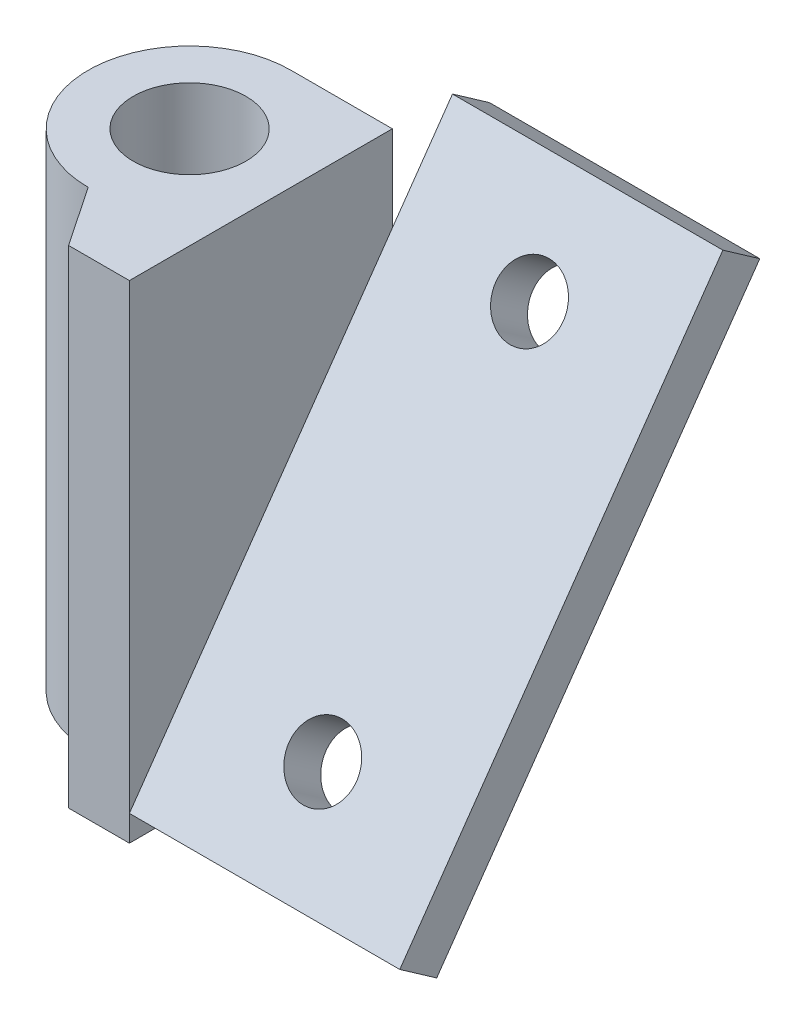
ISO-10303-21;
HEADER;
FILE_DESCRIPTION(('STEP AP214'),'2;1');
FILE_NAME('part.step','',(''),(''),'','','');
FILE_SCHEMA(('AUTOMOTIVE_DESIGN { 1 0 10303 214 1 1 1 1 }'));
ENDSEC;
DATA;
#1=APPLICATION_CONTEXT('core data for automotive mechanical design processes');
#2=APPLICATION_PROTOCOL_DEFINITION('international standard','automotive_design',2000,#1);
#3=PRODUCT_CONTEXT('',#1,'mechanical');
#4=PRODUCT('Part','Part','',(#3));
#5=PRODUCT_RELATED_PRODUCT_CATEGORY('part','',(#4));
#6=PRODUCT_DEFINITION_FORMATION('','',#4);
#7=PRODUCT_DEFINITION_CONTEXT('part definition',#1,'design');
#8=PRODUCT_DEFINITION('design','',#6,#7);
#9=PRODUCT_DEFINITION_SHAPE('','',#8);
#10=(LENGTH_UNIT() NAMED_UNIT(*) SI_UNIT(.MILLI.,.METRE.));
#11=(NAMED_UNIT(*) PLANE_ANGLE_UNIT() SI_UNIT($,.RADIAN.));
#12=(NAMED_UNIT(*) SI_UNIT($,.STERADIAN.) SOLID_ANGLE_UNIT());
#13=UNCERTAINTY_MEASURE_WITH_UNIT(LENGTH_MEASURE(1.E-05),#10,'distance_accuracy_value','');
#14=(GEOMETRIC_REPRESENTATION_CONTEXT(3) GLOBAL_UNCERTAINTY_ASSIGNED_CONTEXT((#13)) GLOBAL_UNIT_ASSIGNED_CONTEXT((#10,
#11,#12)) REPRESENTATION_CONTEXT('',''));
#15=CARTESIAN_POINT('',(0.,0.,0.));
#16=DIRECTION('',(0.,0.,1.));
#17=DIRECTION('',(1.,0.,0.));
#18=AXIS2_PLACEMENT_3D('',#15,#16,#17);
#19=CARTESIAN_POINT('',(0.,10.,0.));
#20=DIRECTION('',(0.,1.,0.));
#21=DIRECTION('',(0.,0.,1.));
#22=AXIS2_PLACEMENT_3D('',#19,#20,#21);
#23=PLANE('',#22);
#24=DIRECTION('',(-1.,0.,0.));
#25=VECTOR('',#24,1.);
#26=CARTESIAN_POINT('',(4.5,10.,-4.5));
#27=LINE('',#26,#25);
#28=CARTESIAN_POINT('',(5.03673261402154,10.,-4.5));
#29=VERTEX_POINT('',#28);
#30=CARTESIAN_POINT('',(4.5,10.,-4.5));
#31=VERTEX_POINT('',#30);
#32=EDGE_CURVE('E48',#29,#31,#27,.T.);
#33=ORIENTED_EDGE('',*,*,#32,.T.);
#34=DIRECTION('',(0.,0.,1.));
#35=VECTOR('',#34,1.);
#36=CARTESIAN_POINT('',(4.5,10.,0.));
#37=LINE('',#36,#35);
#38=CARTESIAN_POINT('',(4.5,10.,-3.72284997085863));
#39=VERTEX_POINT('',#38);
#40=EDGE_CURVE('E196',#31,#39,#37,.T.);
#41=ORIENTED_EDGE('',*,*,#40,.T.);
#42=DIRECTION('',(-1.,0.,0.));
#43=VECTOR('',#42,1.);
#44=CARTESIAN_POINT('',(16.5,10.,-3.72284997085863));
#45=LINE('',#44,#43);
#46=CARTESIAN_POINT('',(6.5,10.,-3.72284997085863));
#47=VERTEX_POINT('',#46);
#48=EDGE_CURVE('E261',#47,#39,#45,.T.);
#49=ORIENTED_EDGE('',*,*,#48,.F.);
#50=CARTESIAN_POINT('',(6.5,10.,-6.16439914838155));
#51=DIRECTION('',(0.,1.,0.));
#52=DIRECTION('',(0.,0.,1.));
#53=AXIS2_PLACEMENT_3D('',#50,#51,#52);
#54=ELLIPSE('',#53,2.44154917752292,2.);
#55=EDGE_CURVE('E267',#47,#29,#54,.F.);
#56=ORIENTED_EDGE('',*,*,#55,.T.);
#57=EDGE_LOOP('',(#33,#41,#49,#56));
#58=FACE_BOUND('',#57,.T.);
#59=ADVANCED_FACE('F33',(#58),#23,.T.);
#60=CARTESIAN_POINT('',(0.,0.,0.));
#61=DIRECTION('',(0.,1.,0.));
#62=DIRECTION('',(0.,0.,1.));
#63=AXIS2_PLACEMENT_3D('',#60,#61,#62);
#64=PLANE('',#63);
#65=DIRECTION('',(0.,0.,1.));
#66=VECTOR('',#65,1.);
#67=CARTESIAN_POINT('',(4.5,0.,0.));
#68=LINE('',#67,#66);
#69=CARTESIAN_POINT('',(4.5,0.,0.837676233715618));
#70=VERTEX_POINT('',#69);
#71=CARTESIAN_POINT('',(4.5,0.,3.27922541123854));
#72=VERTEX_POINT('',#71);
#73=EDGE_CURVE('E194',#70,#72,#68,.T.);
#74=ORIENTED_EDGE('',*,*,#73,.F.);
#75=CARTESIAN_POINT('',(6.5,0.,0.837676233715616));
#76=DIRECTION('',(0.,1.,0.));
#77=DIRECTION('',(0.,0.,1.));
#78=AXIS2_PLACEMENT_3D('',#75,#76,#77);
#79=ELLIPSE('',#78,2.44154917752292,2.);
#80=CARTESIAN_POINT('',(6.5,0.,3.27922541123854));
#81=VERTEX_POINT('',#80);
#82=EDGE_CURVE('E11',#70,#81,#79,.T.);
#83=ORIENTED_EDGE('',*,*,#82,.T.);
#84=DIRECTION('',(1.,0.,0.));
#85=VECTOR('',#84,1.);
#86=CARTESIAN_POINT('',(0.,0.,3.27922541123854));
#87=LINE('',#86,#85);
#88=EDGE_CURVE('E255',#72,#81,#87,.T.);
#89=ORIENTED_EDGE('',*,*,#88,.F.);
#90=EDGE_LOOP('',(#74,#83,#89));
#91=FACE_BOUND('',#90,.T.);
#92=ADVANCED_FACE('F329',(#91),#64,.F.);
#93=CARTESIAN_POINT('',(4.5,0.,0.));
#94=DIRECTION('',(-1.,0.,0.));
#95=DIRECTION('',(0.,0.,1.));
#96=AXIS2_PLACEMENT_3D('',#93,#94,#95);
#97=PLANE('',#96);
#98=DIRECTION('',(0.,0.819152044288989,-0.57357643635105));
#99=VECTOR('',#98,1.);
#100=CARTESIAN_POINT('',(4.5,11.1098852650578,-4.5));
#101=LINE('',#100,#99);
#102=CARTESIAN_POINT('',(4.5,11.1098852650578,-4.5));
#103=VERTEX_POINT('',#102);
#104=CARTESIAN_POINT('',(4.5,17.2623605068708,-8.8080095429661));
#105=VERTEX_POINT('',#104);
#106=EDGE_CURVE('E229',#103,#105,#101,.T.);
#107=ORIENTED_EDGE('',*,*,#106,.F.);
#108=DIRECTION('',(0.,1.,0.));
#109=VECTOR('',#108,1.);
#110=CARTESIAN_POINT('',(4.5,-3.21644060035393,-4.5));
#111=LINE('',#110,#109);
#112=CARTESIAN_POINT('',(4.5,14.5967788563,-4.5));
#113=VERTEX_POINT('',#112);
#114=EDGE_CURVE('E192',#103,#113,#111,.T.);
#115=ORIENTED_EDGE('',*,*,#114,.T.);
#116=DIRECTION('',(0.,-0.819152044288989,0.57357643635105));
#117=VECTOR('',#116,1.);
#118=CARTESIAN_POINT('',(4.5,1.74344679562108,4.5));
#119=LINE('',#118,#117);
#120=CARTESIAN_POINT('',(4.5,18.4095133795729,-7.16970545438812));
#121=VERTEX_POINT('',#120);
#122=EDGE_CURVE('E241',#121,#113,#119,.T.);
#123=ORIENTED_EDGE('',*,*,#122,.F.);
#124=DIRECTION('',(0.,0.57357643635105,0.819152044288989));
#125=VECTOR('',#124,1.);
#126=CARTESIAN_POINT('',(4.5,17.2623605068708,-8.8080095429661));
#127=LINE('',#126,#125);
#128=EDGE_CURVE('E226',#105,#121,#127,.T.);
#129=ORIENTED_EDGE('',*,*,#128,.F.);
#130=EDGE_LOOP('',(#107,#115,#123,#129));
#131=FACE_BOUND('',#130,.T.);
#132=ADVANCED_FACE('F313',(#131),#97,.T.);
#133=CARTESIAN_POINT('',(4.5,10.,0.));
#134=DIRECTION('',(-1.,0.,0.));
#135=DIRECTION('',(0.,0.,1.));
#136=AXIS2_PLACEMENT_3D('',#133,#134,#135);
#137=PLANE('',#136);
#138=CARTESIAN_POINT('',(4.50000000000001,-2.06928772765183,7.16970545438812));
#139=VERTEX_POINT('',#138);
#140=EDGE_CURVE('E248',#113,#139,#119,.T.);
#141=ORIENTED_EDGE('',*,*,#140,.F.);
#142=CARTESIAN_POINT('',(4.5,18.4095133795729,-4.5));
#143=VERTEX_POINT('',#142);
#144=EDGE_CURVE('E190',#113,#143,#111,.T.);
#145=ORIENTED_EDGE('',*,*,#144,.T.);
#146=DIRECTION('',(0.,0.,1.));
#147=VECTOR('',#146,1.);
#148=CARTESIAN_POINT('',(4.5,18.4095133795729,-4.5));
#149=LINE('',#148,#147);
#150=CARTESIAN_POINT('',(4.50000000000001,18.4095133795729,7.16970545438812));
#151=VERTEX_POINT('',#150);
#152=EDGE_CURVE('E172',#143,#151,#149,.T.);
#153=ORIENTED_EDGE('',*,*,#152,.T.);
#154=DIRECTION('',(0.,1.,0.));
#155=VECTOR('',#154,1.);
#156=CARTESIAN_POINT('',(4.50000000000001,-8.44877537683658,7.16970545438812));
#157=LINE('',#156,#155);
#158=EDGE_CURVE('E146',#139,#151,#157,.T.);
#159=ORIENTED_EDGE('',*,*,#158,.F.);
#160=EDGE_LOOP('',(#141,#145,#153,#159));
#161=FACE_BOUND('',#160,.T.);
#162=ADVANCED_FACE('F291',(#161),#137,.F.);
#163=DIRECTION('',(0.,-1.,0.));
#164=VECTOR('',#163,1.);
#165=CARTESIAN_POINT('',(4.5,10.,-4.5));
#166=LINE('',#165,#164);
#167=CARTESIAN_POINT('',(4.5,7.62299167381564,-4.5));
#168=VERTEX_POINT('',#167);
#169=CARTESIAN_POINT('',(4.5,-3.21644060035393,-4.5));
#170=VERTEX_POINT('',#169);
#171=EDGE_CURVE('E252',#168,#170,#166,.T.);
#172=ORIENTED_EDGE('',*,*,#171,.F.);
#173=DIRECTION('',(0.,0.819152044288989,-0.57357643635105));
#174=VECTOR('',#173,1.);
#175=CARTESIAN_POINT('',(4.5,-1.1471528727021,1.64092132266056));
#176=LINE('',#175,#174);
#177=EDGE_CURVE('E264',#168,#70,#176,.F.);
#178=ORIENTED_EDGE('',*,*,#177,.T.);
#179=ORIENTED_EDGE('',*,*,#73,.T.);
#180=DIRECTION('',(0.,-0.819152044288989,0.57357643635105));
#181=VECTOR('',#180,1.);
#182=CARTESIAN_POINT('',(4.5,17.2623605068708,-8.8080095429661));
#183=LINE('',#182,#181);
#184=CARTESIAN_POINT('',(4.50000000000001,-3.21644060035393,5.53140136581015));
#185=VERTEX_POINT('',#184);
#186=EDGE_CURVE('E212',#72,#185,#183,.T.);
#187=ORIENTED_EDGE('',*,*,#186,.T.);
#188=DIRECTION('',(0.,0.,1.));
#189=VECTOR('',#188,1.);
#190=CARTESIAN_POINT('',(4.5,-3.21644060035393,-4.5));
#191=LINE('',#190,#189);
#192=EDGE_CURVE('E183',#170,#185,#191,.T.);
#193=ORIENTED_EDGE('',*,*,#192,.F.);
#194=EDGE_LOOP('',(#172,#178,#179,#187,#193));
#195=FACE_BOUND('',#194,.T.);
#196=ADVANCED_FACE('F275',(#195),#137,.F.);
#197=CARTESIAN_POINT('',(0.,10.,0.));
#198=DIRECTION('',(0.,-1.,0.));
#199=DIRECTION('',(0.,0.,-1.));
#200=AXIS2_PLACEMENT_3D('',#197,#198,#199);
#201=CYLINDRICAL_SURFACE('',#200,4.5);
#202=DIRECTION('',(0.,-1.,0.));
#203=VECTOR('',#202,1.);
#204=CARTESIAN_POINT('',(0.,10.,-4.5));
#205=LINE('',#204,#203);
#206=CARTESIAN_POINT('',(0.,18.4095133795729,-4.5));
#207=VERTEX_POINT('',#206);
#208=CARTESIAN_POINT('',(0.,-3.21644060035393,-4.5));
#209=VERTEX_POINT('',#208);
#210=EDGE_CURVE('E250',#207,#209,#205,.T.);
#211=ORIENTED_EDGE('',*,*,#210,.T.);
#212=CARTESIAN_POINT('',(0.,-3.21644060035393,0.));
#213=DIRECTION('',(0.,-1.,0.));
#214=DIRECTION('',(0.,0.,-1.));
#215=AXIS2_PLACEMENT_3D('',#212,#213,#214);
#216=CIRCLE('',#215,4.5);
#217=CARTESIAN_POINT('',(0.,-3.21644060035393,4.5));
#218=VERTEX_POINT('',#217);
#219=EDGE_CURVE('E185',#218,#209,#216,.T.);
#220=ORIENTED_EDGE('',*,*,#219,.F.);
#221=DIRECTION('',(0.,-1.,0.));
#222=VECTOR('',#221,1.);
#223=CARTESIAN_POINT('',(0.,10.,4.5));
#224=LINE('',#223,#222);
#225=CARTESIAN_POINT('',(0.,18.4095133795729,4.5));
#226=VERTEX_POINT('',#225);
#227=EDGE_CURVE('E160',#226,#218,#224,.T.);
#228=ORIENTED_EDGE('',*,*,#227,.F.);
#229=CARTESIAN_POINT('',(0.,18.4095133795729,0.));
#230=DIRECTION('',(0.,-1.,0.));
#231=DIRECTION('',(0.,0.,-1.));
#232=AXIS2_PLACEMENT_3D('',#229,#230,#231);
#233=CIRCLE('',#232,4.5);
#234=EDGE_CURVE('E174',#226,#207,#233,.T.);
#235=ORIENTED_EDGE('',*,*,#234,.T.);
#236=EDGE_LOOP('',(#211,#220,#228,#235));
#237=FACE_BOUND('',#236,.T.);
#238=ADVANCED_FACE('F282',(#237),#201,.T.);
#239=CARTESIAN_POINT('',(4.5,10.,-4.5));
#240=DIRECTION('',(0.,0.,1.));
#241=DIRECTION('',(1.,0.,0.));
#242=AXIS2_PLACEMENT_3D('',#239,#240,#241);
#243=PLANE('',#242);
#244=ORIENTED_EDGE('',*,*,#210,.F.);
#245=DIRECTION('',(1.,0.,0.));
#246=VECTOR('',#245,1.);
#247=CARTESIAN_POINT('',(4.5,18.4095133795729,-4.5));
#248=LINE('',#247,#246);
#249=EDGE_CURVE('E177',#207,#143,#248,.T.);
#250=ORIENTED_EDGE('',*,*,#249,.T.);
#251=ORIENTED_EDGE('',*,*,#144,.F.);
#252=ORIENTED_EDGE('',*,*,#114,.F.);
#253=EDGE_CURVE('E193',#31,#103,#111,.T.);
#254=ORIENTED_EDGE('',*,*,#253,.F.);
#255=ORIENTED_EDGE('',*,*,#32,.F.);
#256=CARTESIAN_POINT('',(6.5,7.62299167381564,-4.5));
#257=DIRECTION('',(0.,0.,1.));
#258=DIRECTION('',(0.,-1.,0.));
#259=AXIS2_PLACEMENT_3D('',#256,#257,#258);
#260=ELLIPSE('',#259,3.48689359124217,2.);
#261=EDGE_CURVE('E41',#29,#168,#260,.T.);
#262=ORIENTED_EDGE('',*,*,#261,.T.);
#263=ORIENTED_EDGE('',*,*,#171,.T.);
#264=DIRECTION('',(1.,0.,0.));
#265=VECTOR('',#264,1.);
#266=CARTESIAN_POINT('',(4.5,-3.21644060035393,-4.5));
#267=LINE('',#266,#265);
#268=EDGE_CURVE('E187',#209,#170,#267,.T.);
#269=ORIENTED_EDGE('',*,*,#268,.F.);
#270=EDGE_LOOP('',(#244,#250,#251,#252,#254,#255,#262,#263,#269));
#271=FACE_BOUND('',#270,.T.);
#272=ADVANCED_FACE('F279',(#271),#243,.F.);
#273=CARTESIAN_POINT('',(16.5,11.1098852650578,-4.5));
#274=DIRECTION('',(0.,0.57357643635105,0.819152044288989));
#275=DIRECTION('',(0.,-0.819152044288989,0.57357643635105));
#276=AXIS2_PLACEMENT_3D('',#273,#274,#275);
#277=PLANE('',#276);
#278=CARTESIAN_POINT('',(10.5,0.469743598946521,2.95030740223042));
#279=DIRECTION('',(0.,0.57357643635105,0.819152044288989));
#280=DIRECTION('',(0.,-0.819152044288989,0.57357643635105));
#281=AXIS2_PLACEMENT_3D('',#278,#279,#280);
#282=CIRCLE('',#281,1.5);
#283=CARTESIAN_POINT('',(10.5,-0.758984467486964,3.810672056757));
#284=VERTEX_POINT('',#283);
#285=EDGE_CURVE('E200',#284,#284,#282,.T.);
#286=ORIENTED_EDGE('',*,*,#285,.T.);
#287=EDGE_LOOP('',(#286));
#288=FACE_BOUND('',#287,.T.);
#289=DIRECTION('',(0.,0.819152044288989,-0.57357643635105));
#290=VECTOR('',#289,1.);
#291=CARTESIAN_POINT('',(6.5,10.,-3.72284997085863));
#292=LINE('',#291,#290);
#293=EDGE_CURVE('E258',#81,#47,#292,.T.);
#294=ORIENTED_EDGE('',*,*,#293,.T.);
#295=ORIENTED_EDGE('',*,*,#48,.T.);
#296=EDGE_CURVE('E243',#39,#103,#101,.T.);
#297=ORIENTED_EDGE('',*,*,#296,.T.);
#298=ORIENTED_EDGE('',*,*,#106,.T.);
#299=DIRECTION('',(-1.,0.,0.));
#300=VECTOR('',#299,1.);
#301=CARTESIAN_POINT('',(4.5,17.2623605068708,-8.8080095429661));
#302=LINE('',#301,#300);
#303=CARTESIAN_POINT('',(16.5,17.2623605068708,-8.8080095429661));
#304=VERTEX_POINT('',#303);
#305=EDGE_CURVE('E218',#304,#105,#302,.T.);
#306=ORIENTED_EDGE('',*,*,#305,.F.);
#307=DIRECTION('',(0.,0.819152044288989,-0.57357643635105));
#308=VECTOR('',#307,1.);
#309=CARTESIAN_POINT('',(16.5,11.1098852650578,-4.5));
#310=LINE('',#309,#308);
#311=CARTESIAN_POINT('',(16.5,-3.21644060035393,5.53140136581015));
#312=VERTEX_POINT('',#311);
#313=EDGE_CURVE('E238',#312,#304,#310,.T.);
#314=ORIENTED_EDGE('',*,*,#313,.F.);
#315=DIRECTION('',(1.,0.,0.));
#316=VECTOR('',#315,1.);
#317=CARTESIAN_POINT('',(4.50000000000001,-3.21644060035393,5.53140136581015));
#318=LINE('',#317,#316);
#319=EDGE_CURVE('E214',#185,#312,#318,.T.);
#320=ORIENTED_EDGE('',*,*,#319,.F.);
#321=ORIENTED_EDGE('',*,*,#186,.F.);
#322=ORIENTED_EDGE('',*,*,#88,.T.);
#323=EDGE_LOOP('',(#294,#295,#297,#298,#306,#314,#320,#321,#322));
#324=FACE_BOUND('',#323,.T.);
#325=CARTESIAN_POINT('',(10.5,13.5761763075703,-6.22691557938638));
#326=DIRECTION('',(0.,0.57357643635105,0.819152044288989));
#327=DIRECTION('',(0.,-0.819152044288989,0.57357643635105));
#328=AXIS2_PLACEMENT_3D('',#325,#326,#327);
#329=CIRCLE('',#328,1.5);
#330=CARTESIAN_POINT('',(10.5,12.3474482411369,-5.3665509248598));
#331=VERTEX_POINT('',#330);
#332=EDGE_CURVE('E206',#331,#331,#329,.T.);
#333=ORIENTED_EDGE('',*,*,#332,.T.);
#334=EDGE_LOOP('',(#333));
#335=FACE_BOUND('',#334,.T.);
#336=ADVANCED_FACE('F300',(#288,#324,#335),#277,.F.);
#337=CARTESIAN_POINT('',(16.5,1.74344679562108,4.5));
#338=DIRECTION('',(0.,-0.57357643635105,-0.819152044288989));
#339=DIRECTION('',(0.,0.819152044288989,-0.57357643635105));
#340=AXIS2_PLACEMENT_3D('',#337,#338,#339);
#341=PLANE('',#340);
#342=CARTESIAN_POINT('',(10.5,1.61689647164862,4.5886114908084));
#343=DIRECTION('',(0.,0.57357643635105,0.819152044288989));
#344=DIRECTION('',(0.,-0.819152044288989,0.57357643635105));
#345=AXIS2_PLACEMENT_3D('',#342,#343,#344);
#346=CIRCLE('',#345,1.5);
#347=CARTESIAN_POINT('',(10.5,0.388168405215136,5.44897614533498));
#348=VERTEX_POINT('',#347);
#349=EDGE_CURVE('E199',#348,#348,#346,.T.);
#350=ORIENTED_EDGE('',*,*,#349,.F.);
#351=EDGE_LOOP('',(#350));
#352=FACE_BOUND('',#351,.T.);
#353=CARTESIAN_POINT('',(10.5,14.7233291802724,-4.5886114908084));
#354=DIRECTION('',(0.,0.57357643635105,0.819152044288989));
#355=DIRECTION('',(0.,-0.819152044288989,0.57357643635105));
#356=AXIS2_PLACEMENT_3D('',#353,#354,#355);
#357=CIRCLE('',#356,1.5);
#358=CARTESIAN_POINT('',(10.5,13.494601113839,-3.72824683628182));
#359=VERTEX_POINT('',#358);
#360=EDGE_CURVE('E203',#359,#359,#357,.T.);
#361=ORIENTED_EDGE('',*,*,#360,.F.);
#362=EDGE_LOOP('',(#361));
#363=FACE_BOUND('',#362,.T.);
#364=DIRECTION('',(0.,-0.819152044288989,0.57357643635105));
#365=VECTOR('',#364,1.);
#366=CARTESIAN_POINT('',(16.5,1.74344679562108,4.5));
#367=LINE('',#366,#365);
#368=CARTESIAN_POINT('',(16.5,18.4095133795729,-7.16970545438812));
#369=VERTEX_POINT('',#368);
#370=CARTESIAN_POINT('',(16.5,-2.06928772765183,7.16970545438812));
#371=VERTEX_POINT('',#370);
#372=EDGE_CURVE('E240',#369,#371,#367,.T.);
#373=ORIENTED_EDGE('',*,*,#372,.F.);
#374=DIRECTION('',(-1.,0.,0.));
#375=VECTOR('',#374,1.);
#376=CARTESIAN_POINT('',(4.5,18.4095133795729,-7.16970545438812));
#377=LINE('',#376,#375);
#378=EDGE_CURVE('E215',#369,#121,#377,.T.);
#379=ORIENTED_EDGE('',*,*,#378,.T.);
#380=ORIENTED_EDGE('',*,*,#122,.T.);
#381=ORIENTED_EDGE('',*,*,#140,.T.);
#382=DIRECTION('',(1.,0.,0.));
#383=VECTOR('',#382,1.);
#384=CARTESIAN_POINT('',(4.50000000000001,-2.06928772765183,7.16970545438812));
#385=LINE('',#384,#383);
#386=EDGE_CURVE('E209',#139,#371,#385,.T.);
#387=ORIENTED_EDGE('',*,*,#386,.T.);
#388=EDGE_LOOP('',(#373,#379,#380,#381,#387));
#389=FACE_BOUND('',#388,.T.);
#390=ADVANCED_FACE('F308',(#352,#363,#389),#341,.F.);
#391=CARTESIAN_POINT('',(16.5,0.,0.));
#392=DIRECTION('',(-1.,0.,0.));
#393=DIRECTION('',(0.,0.,1.));
#394=AXIS2_PLACEMENT_3D('',#391,#392,#393);
#395=PLANE('',#394);
#396=DIRECTION('',(0.,0.57357643635105,0.819152044288989));
#397=VECTOR('',#396,1.);
#398=CARTESIAN_POINT('',(16.5,-3.21644060035393,5.53140136581015));
#399=LINE('',#398,#397);
#400=EDGE_CURVE('E233',#312,#371,#399,.T.);
#401=ORIENTED_EDGE('',*,*,#400,.F.);
#402=ORIENTED_EDGE('',*,*,#313,.T.);
#403=DIRECTION('',(0.,0.57357643635105,0.819152044288989));
#404=VECTOR('',#403,1.);
#405=CARTESIAN_POINT('',(16.5,17.2623605068708,-8.8080095429661));
#406=LINE('',#405,#404);
#407=EDGE_CURVE('E230',#304,#369,#406,.T.);
#408=ORIENTED_EDGE('',*,*,#407,.T.);
#409=ORIENTED_EDGE('',*,*,#372,.T.);
#410=EDGE_LOOP('',(#401,#402,#408,#409));
#411=FACE_BOUND('',#410,.T.);
#412=ADVANCED_FACE('F306',(#411),#395,.F.);
#413=CARTESIAN_POINT('',(4.5,17.2623605068708,-8.8080095429661));
#414=DIRECTION('',(0.,0.819152044288989,-0.57357643635105));
#415=DIRECTION('',(0.,0.57357643635105,0.819152044288989));
#416=AXIS2_PLACEMENT_3D('',#413,#414,#415);
#417=PLANE('',#416);
#418=ORIENTED_EDGE('',*,*,#378,.F.);
#419=ORIENTED_EDGE('',*,*,#407,.F.);
#420=ORIENTED_EDGE('',*,*,#305,.T.);
#421=ORIENTED_EDGE('',*,*,#128,.T.);
#422=EDGE_LOOP('',(#418,#419,#420,#421));
#423=FACE_BOUND('',#422,.T.);
#424=ADVANCED_FACE('F315',(#423),#417,.T.);
#425=CARTESIAN_POINT('',(10.5,13.5761763075703,-6.22691557938638));
#426=DIRECTION('',(0.,0.57357643635105,0.819152044288989));
#427=DIRECTION('',(0.,-0.819152044288989,0.57357643635105));
#428=AXIS2_PLACEMENT_3D('',#425,#426,#427);
#429=CYLINDRICAL_SURFACE('',#428,1.5);
#430=ORIENTED_EDGE('',*,*,#332,.F.);
#431=EDGE_LOOP('',(#430));
#432=FACE_BOUND('',#431,.T.);
#433=ORIENTED_EDGE('',*,*,#360,.T.);
#434=EDGE_LOOP('',(#433));
#435=FACE_BOUND('',#434,.T.);
#436=ADVANCED_FACE('F317',(#432,#435),#429,.F.);
#437=CARTESIAN_POINT('',(10.5,0.469743598946521,2.95030740223042));
#438=DIRECTION('',(0.,0.57357643635105,0.819152044288989));
#439=DIRECTION('',(0.,-0.819152044288989,0.57357643635105));
#440=AXIS2_PLACEMENT_3D('',#437,#438,#439);
#441=CYLINDRICAL_SURFACE('',#440,1.5);
#442=ORIENTED_EDGE('',*,*,#285,.F.);
#443=EDGE_LOOP('',(#442));
#444=FACE_BOUND('',#443,.T.);
#445=ORIENTED_EDGE('',*,*,#349,.T.);
#446=EDGE_LOOP('',(#445));
#447=FACE_BOUND('',#446,.T.);
#448=ADVANCED_FACE('F323',(#444,#447),#441,.F.);
#449=CARTESIAN_POINT('',(4.50000000000001,-3.21644060035393,5.53140136581015));
#450=DIRECTION('',(0.,-0.819152044288989,0.57357643635105));
#451=DIRECTION('',(0.,-0.57357643635105,-0.819152044288989));
#452=AXIS2_PLACEMENT_3D('',#449,#450,#451);
#453=PLANE('',#452);
#454=ORIENTED_EDGE('',*,*,#386,.F.);
#455=DIRECTION('',(0.,0.57357643635105,0.819152044288989));
#456=VECTOR('',#455,1.);
#457=CARTESIAN_POINT('',(4.50000000000001,-3.21644060035393,5.53140136581015));
#458=LINE('',#457,#456);
#459=EDGE_CURVE('E221',#185,#139,#458,.T.);
#460=ORIENTED_EDGE('',*,*,#459,.F.);
#461=ORIENTED_EDGE('',*,*,#319,.T.);
#462=ORIENTED_EDGE('',*,*,#400,.T.);
#463=EDGE_LOOP('',(#454,#460,#461,#462));
#464=FACE_BOUND('',#463,.T.);
#465=ADVANCED_FACE('F297',(#464),#453,.T.);
#466=CARTESIAN_POINT('',(6.5,9.96273239235571,-6.13830408857798));
#467=DIRECTION('',(0.,-0.819152044288989,0.57357643635105));
#468=DIRECTION('',(0.,-0.57357643635105,-0.819152044288989));
#469=AXIS2_PLACEMENT_3D('',#466,#467,#468);
#470=CYLINDRICAL_SURFACE('',#469,2.);
#471=ORIENTED_EDGE('',*,*,#82,.F.);
#472=ORIENTED_EDGE('',*,*,#177,.F.);
#473=ORIENTED_EDGE('',*,*,#261,.F.);
#474=ORIENTED_EDGE('',*,*,#55,.F.);
#475=ORIENTED_EDGE('',*,*,#293,.F.);
#476=EDGE_LOOP('',(#471,#472,#473,#474,#475));
#477=FACE_BOUND('',#476,.T.);
#478=ADVANCED_FACE('F35',(#477),#470,.F.);
#479=CARTESIAN_POINT('',(0.,-3.21644060035393,0.));
#480=DIRECTION('',(0.,-1.,0.));
#481=DIRECTION('',(0.,0.,-1.));
#482=AXIS2_PLACEMENT_3D('',#479,#480,#481);
#483=PLANE('',#482);
#484=ORIENTED_EDGE('',*,*,#192,.T.);
#485=DIRECTION('',(0.,0.,-1.));
#486=VECTOR('',#485,1.);
#487=CARTESIAN_POINT('',(4.50000000000001,-3.21644060035393,7.16970545438812));
#488=LINE('',#487,#486);
#489=CARTESIAN_POINT('',(4.50000000000001,-3.21644060035393,7.16970545438812));
#490=VERTEX_POINT('',#489);
#491=EDGE_CURVE('E142',#490,#185,#488,.T.);
#492=ORIENTED_EDGE('',*,*,#491,.F.);
#493=DIRECTION('',(1.,0.,0.));
#494=VECTOR('',#493,1.);
#495=CARTESIAN_POINT('',(1.80073906644549,-3.21644060035393,7.16970545438812));
#496=LINE('',#495,#494);
#497=CARTESIAN_POINT('',(1.80073906644549,-3.21644060035393,7.16970545438812));
#498=VERTEX_POINT('',#497);
#499=EDGE_CURVE('E132',#498,#490,#496,.T.);
#500=ORIENTED_EDGE('',*,*,#499,.F.);
#501=DIRECTION('',(0.559192903470751,0.,0.829037572555039));
#502=VECTOR('',#501,1.);
#503=CARTESIAN_POINT('',(0.,-3.21644060035393,4.5));
#504=LINE('',#503,#502);
#505=EDGE_CURVE('E139',#218,#498,#504,.T.);
#506=ORIENTED_EDGE('',*,*,#505,.F.);
#507=ORIENTED_EDGE('',*,*,#219,.T.);
#508=ORIENTED_EDGE('',*,*,#268,.T.);
#509=EDGE_LOOP('',(#484,#492,#500,#506,#507,#508));
#510=FACE_BOUND('',#509,.T.);
#511=CARTESIAN_POINT('',(0.,-3.21644060035393,0.));
#512=DIRECTION('',(0.,-1.,0.));
#513=DIRECTION('',(0.,0.,-1.));
#514=AXIS2_PLACEMENT_3D('',#511,#512,#513);
#515=CIRCLE('',#514,2.5);
#516=CARTESIAN_POINT('',(0.,-3.21644060035393,-2.5));
#517=VERTEX_POINT('',#516);
#518=EDGE_CURVE('E180',#517,#517,#515,.T.);
#519=ORIENTED_EDGE('',*,*,#518,.F.);
#520=EDGE_LOOP('',(#519));
#521=FACE_BOUND('',#520,.T.);
#522=ADVANCED_FACE('F135',(#510,#521),#483,.T.);
#523=CARTESIAN_POINT('',(4.5,-3.21644060035393,-4.5));
#524=DIRECTION('',(-1.,0.,0.));
#525=DIRECTION('',(0.,0.,1.));
#526=AXIS2_PLACEMENT_3D('',#523,#524,#525);
#527=PLANE('',#526);
#528=ORIENTED_EDGE('',*,*,#40,.F.);
#529=ORIENTED_EDGE('',*,*,#253,.T.);
#530=ORIENTED_EDGE('',*,*,#296,.F.);
#531=EDGE_LOOP('',(#528,#529,#530));
#532=FACE_BOUND('',#531,.T.);
#533=ADVANCED_FACE('F462',(#532),#527,.F.);
#534=CARTESIAN_POINT('',(0.,18.4095133795729,0.));
#535=DIRECTION('',(0.,-1.,0.));
#536=DIRECTION('',(0.,0.,-1.));
#537=AXIS2_PLACEMENT_3D('',#534,#535,#536);
#538=PLANE('',#537);
#539=CARTESIAN_POINT('',(0.,18.4095133795729,0.));
#540=DIRECTION('',(0.,-1.,0.));
#541=DIRECTION('',(0.,0.,-1.));
#542=AXIS2_PLACEMENT_3D('',#539,#540,#541);
#543=CIRCLE('',#542,2.5);
#544=CARTESIAN_POINT('',(0.,18.4095133795729,-2.5));
#545=VERTEX_POINT('',#544);
#546=EDGE_CURVE('E166',#545,#545,#543,.T.);
#547=ORIENTED_EDGE('',*,*,#546,.T.);
#548=EDGE_LOOP('',(#547));
#549=FACE_BOUND('',#548,.T.);
#550=ORIENTED_EDGE('',*,*,#152,.F.);
#551=ORIENTED_EDGE('',*,*,#249,.F.);
#552=ORIENTED_EDGE('',*,*,#234,.F.);
#553=DIRECTION('',(0.559192903470751,0.,0.829037572555039));
#554=VECTOR('',#553,1.);
#555=CARTESIAN_POINT('',(0.,18.4095133795729,4.5));
#556=LINE('',#555,#554);
#557=CARTESIAN_POINT('',(1.80073906644549,18.4095133795729,7.16970545438812));
#558=VERTEX_POINT('',#557);
#559=EDGE_CURVE('E162',#226,#558,#556,.T.);
#560=ORIENTED_EDGE('',*,*,#559,.T.);
#561=DIRECTION('',(1.,0.,0.));
#562=VECTOR('',#561,1.);
#563=CARTESIAN_POINT('',(1.80073906644549,18.4095133795729,7.16970545438812));
#564=LINE('',#563,#562);
#565=EDGE_CURVE('E153',#558,#151,#564,.T.);
#566=ORIENTED_EDGE('',*,*,#565,.T.);
#567=EDGE_LOOP('',(#550,#551,#552,#560,#566));
#568=FACE_BOUND('',#567,.T.);
#569=ADVANCED_FACE('F288',(#549,#568),#538,.F.);
#570=CARTESIAN_POINT('',(0.,10.,0.));
#571=DIRECTION('',(0.,-1.,0.));
#572=DIRECTION('',(0.,0.,-1.));
#573=AXIS2_PLACEMENT_3D('',#570,#571,#572);
#574=CYLINDRICAL_SURFACE('',#573,2.5);
#575=ORIENTED_EDGE('',*,*,#518,.T.);
#576=EDGE_LOOP('',(#575));
#577=FACE_BOUND('',#576,.T.);
#578=ORIENTED_EDGE('',*,*,#546,.F.);
#579=EDGE_LOOP('',(#578));
#580=FACE_BOUND('',#579,.T.);
#581=ADVANCED_FACE('F338',(#577,#580),#574,.F.);
#582=CARTESIAN_POINT('',(0.,-8.44877537683658,4.5));
#583=DIRECTION('',(-0.829037572555039,0.,0.559192903470751));
#584=DIRECTION('',(0.559192903470751,0.,0.829037572555039));
#585=AXIS2_PLACEMENT_3D('',#582,#583,#584);
#586=PLANE('',#585);
#587=ORIENTED_EDGE('',*,*,#227,.T.);
#588=ORIENTED_EDGE('',*,*,#505,.T.);
#589=DIRECTION('',(0.,1.,0.));
#590=VECTOR('',#589,1.);
#591=CARTESIAN_POINT('',(1.80073906644549,-8.44877537683658,7.16970545438812));
#592=LINE('',#591,#590);
#593=EDGE_CURVE('E147',#498,#558,#592,.T.);
#594=ORIENTED_EDGE('',*,*,#593,.T.);
#595=ORIENTED_EDGE('',*,*,#559,.F.);
#596=EDGE_LOOP('',(#587,#588,#594,#595));
#597=FACE_BOUND('',#596,.T.);
#598=ADVANCED_FACE('F158',(#597),#586,.T.);
#599=CARTESIAN_POINT('',(1.80073906644549,-8.44877537683658,7.16970545438812));
#600=DIRECTION('',(0.,0.,1.));
#601=DIRECTION('',(1.,0.,0.));
#602=AXIS2_PLACEMENT_3D('',#599,#600,#601);
#603=PLANE('',#602);
#604=ORIENTED_EDGE('',*,*,#593,.F.);
#605=ORIENTED_EDGE('',*,*,#499,.T.);
#606=EDGE_CURVE('E167',#490,#139,#157,.T.);
#607=ORIENTED_EDGE('',*,*,#606,.T.);
#608=ORIENTED_EDGE('',*,*,#158,.T.);
#609=ORIENTED_EDGE('',*,*,#565,.F.);
#610=EDGE_LOOP('',(#604,#605,#607,#608,#609));
#611=FACE_BOUND('',#610,.T.);
#612=ADVANCED_FACE('F150',(#611),#603,.T.);
#613=CARTESIAN_POINT('',(4.50000000000001,-8.44877537683658,7.16970545438812));
#614=DIRECTION('',(1.,0.,0.));
#615=DIRECTION('',(0.,0.,-1.));
#616=AXIS2_PLACEMENT_3D('',#613,#614,#615);
#617=PLANE('',#616);
#618=ORIENTED_EDGE('',*,*,#491,.T.);
#619=ORIENTED_EDGE('',*,*,#459,.T.);
#620=ORIENTED_EDGE('',*,*,#606,.F.);
#621=EDGE_LOOP('',(#618,#619,#620));
#622=FACE_BOUND('',#621,.T.);
#623=ADVANCED_FACE('F293',(#622),#617,.T.);
#624=CLOSED_SHELL('',(#59,#92,#132,#162,#196,#238,#272,#336,#390,#412,#424,#436,#448,#465,#478,
#522,#533,#569,#581,#598,#612,#623));
#625=MANIFOLD_SOLID_BREP('B2',#624);
#626=ADVANCED_BREP_SHAPE_REPRESENTATION('',(#18,#625),#14);
#627=SHAPE_DEFINITION_REPRESENTATION(#9,#626);
ENDSEC;
END-ISO-10303-21;
